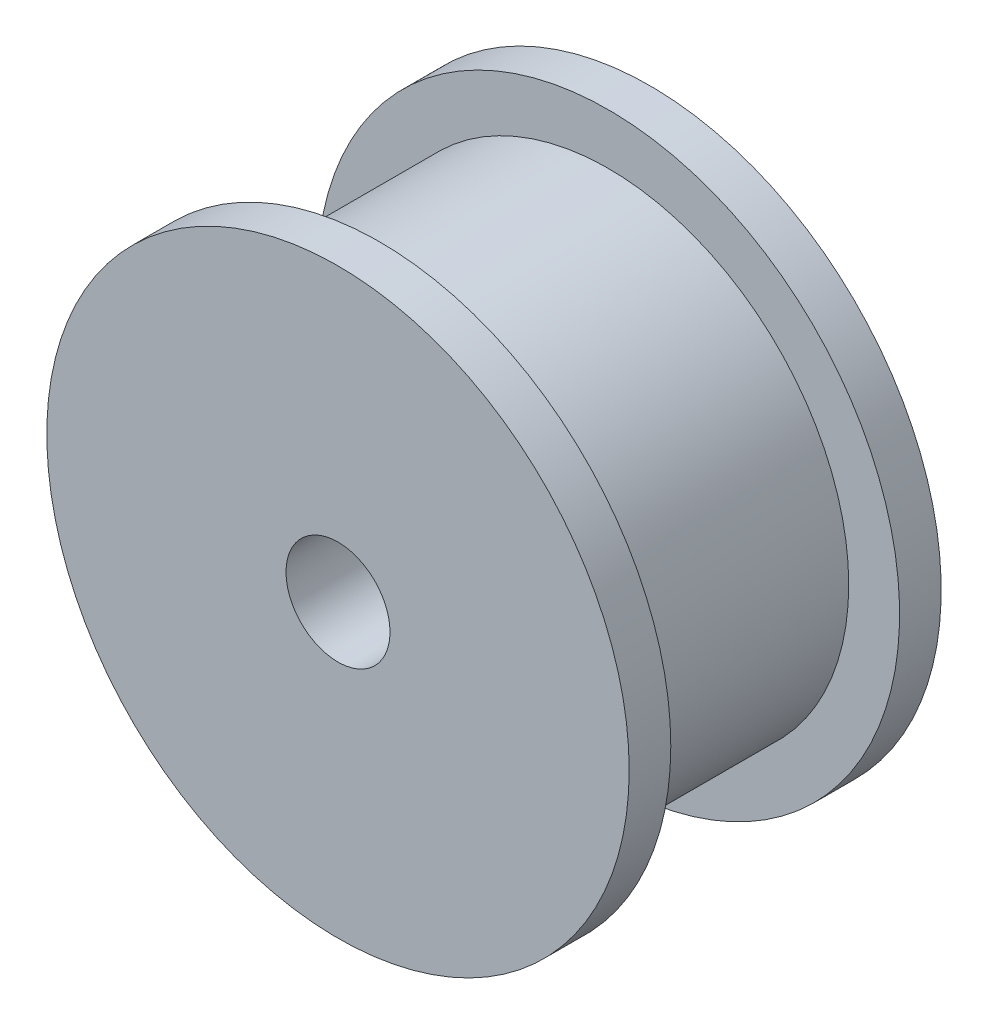
ISO-10303-21;
HEADER;
FILE_DESCRIPTION(('STEP AP214'),'2;1');
FILE_NAME('part.step','',(''),(''),'','','');
FILE_SCHEMA(('AUTOMOTIVE_DESIGN { 1 0 10303 214 1 1 1 1 }'));
ENDSEC;
DATA;
#1=APPLICATION_CONTEXT('core data for automotive mechanical design processes');
#2=APPLICATION_PROTOCOL_DEFINITION('international standard','automotive_design',2000,#1);
#3=PRODUCT_CONTEXT('',#1,'mechanical');
#4=PRODUCT('Part','Part','',(#3));
#5=PRODUCT_RELATED_PRODUCT_CATEGORY('part','',(#4));
#6=PRODUCT_DEFINITION_FORMATION('','',#4);
#7=PRODUCT_DEFINITION_CONTEXT('part definition',#1,'design');
#8=PRODUCT_DEFINITION('design','',#6,#7);
#9=PRODUCT_DEFINITION_SHAPE('','',#8);
#10=(LENGTH_UNIT() NAMED_UNIT(*) SI_UNIT(.MILLI.,.METRE.));
#11=(NAMED_UNIT(*) PLANE_ANGLE_UNIT() SI_UNIT($,.RADIAN.));
#12=(NAMED_UNIT(*) SI_UNIT($,.STERADIAN.) SOLID_ANGLE_UNIT());
#13=UNCERTAINTY_MEASURE_WITH_UNIT(LENGTH_MEASURE(1.E-05),#10,'distance_accuracy_value','');
#14=(GEOMETRIC_REPRESENTATION_CONTEXT(3) GLOBAL_UNCERTAINTY_ASSIGNED_CONTEXT((#13)) GLOBAL_UNIT_ASSIGNED_CONTEXT((#10,
#11,#12)) REPRESENTATION_CONTEXT('',''));
#15=CARTESIAN_POINT('',(0.,0.,0.));
#16=DIRECTION('',(0.,0.,1.));
#17=DIRECTION('',(1.,0.,0.));
#18=AXIS2_PLACEMENT_3D('',#15,#16,#17);
#19=CARTESIAN_POINT('',(0.,0.,11.));
#20=DIRECTION('',(0.,0.,-1.));
#21=DIRECTION('',(-1.,0.,0.));
#22=AXIS2_PLACEMENT_3D('',#19,#20,#21);
#23=CYLINDRICAL_SURFACE('',#22,11.555);
#24=CARTESIAN_POINT('',(0.,0.,11.));
#25=DIRECTION('',(0.,0.,1.));
#26=DIRECTION('',(1.,0.,0.));
#27=AXIS2_PLACEMENT_3D('',#24,#25,#26);
#28=CIRCLE('',#27,11.555);
#29=CARTESIAN_POINT('',(11.555,0.,11.));
#30=VERTEX_POINT('',#29);
#31=EDGE_CURVE('E10',#30,#30,#28,.T.);
#32=ORIENTED_EDGE('',*,*,#31,.F.);
#33=EDGE_LOOP('',(#32));
#34=FACE_BOUND('',#33,.T.);
#35=CARTESIAN_POINT('',(0.,0.,0.));
#36=DIRECTION('',(0.,0.,1.));
#37=DIRECTION('',(1.,0.,0.));
#38=AXIS2_PLACEMENT_3D('',#35,#36,#37);
#39=CIRCLE('',#38,11.555);
#40=CARTESIAN_POINT('',(11.555,0.,0.));
#41=VERTEX_POINT('',#40);
#42=EDGE_CURVE('E39',#41,#41,#39,.T.);
#43=ORIENTED_EDGE('',*,*,#42,.T.);
#44=EDGE_LOOP('',(#43));
#45=FACE_BOUND('',#44,.T.);
#46=ADVANCED_FACE('F36',(#34,#45),#23,.T.);
#47=CARTESIAN_POINT('',(0.,0.,13.));
#48=DIRECTION('',(0.,0.,-1.));
#49=DIRECTION('',(-1.,0.,0.));
#50=AXIS2_PLACEMENT_3D('',#47,#48,#49);
#51=CYLINDRICAL_SURFACE('',#50,14.);
#52=CARTESIAN_POINT('',(0.,0.,13.));
#53=DIRECTION('',(0.,0.,1.));
#54=DIRECTION('',(1.,0.,0.));
#55=AXIS2_PLACEMENT_3D('',#52,#53,#54);
#56=CIRCLE('',#55,14.);
#57=CARTESIAN_POINT('',(14.,0.,13.));
#58=VERTEX_POINT('',#57);
#59=EDGE_CURVE('E44',#58,#58,#56,.T.);
#60=ORIENTED_EDGE('',*,*,#59,.F.);
#61=EDGE_LOOP('',(#60));
#62=FACE_BOUND('',#61,.T.);
#63=CARTESIAN_POINT('',(0.,0.,11.));
#64=DIRECTION('',(0.,0.,1.));
#65=DIRECTION('',(1.,0.,0.));
#66=AXIS2_PLACEMENT_3D('',#63,#64,#65);
#67=CIRCLE('',#66,14.);
#68=CARTESIAN_POINT('',(14.,0.,11.));
#69=VERTEX_POINT('',#68);
#70=EDGE_CURVE('E50',#69,#69,#67,.T.);
#71=ORIENTED_EDGE('',*,*,#70,.T.);
#72=EDGE_LOOP('',(#71));
#73=FACE_BOUND('',#72,.T.);
#74=ADVANCED_FACE('F102',(#62,#73),#51,.T.);
#75=CARTESIAN_POINT('',(0.,0.,13.));
#76=DIRECTION('',(0.,0.,1.));
#77=DIRECTION('',(1.,0.,0.));
#78=AXIS2_PLACEMENT_3D('',#75,#76,#77);
#79=PLANE('',#78);
#80=CARTESIAN_POINT('',(0.,0.,13.));
#81=DIRECTION('',(0.,0.,-1.));
#82=DIRECTION('',(-1.,0.,0.));
#83=AXIS2_PLACEMENT_3D('',#80,#81,#82);
#84=CIRCLE('',#83,2.5);
#85=CARTESIAN_POINT('',(-2.5,0.,13.));
#86=VERTEX_POINT('',#85);
#87=EDGE_CURVE('E61',#86,#86,#84,.T.);
#88=ORIENTED_EDGE('',*,*,#87,.T.);
#89=EDGE_LOOP('',(#88));
#90=FACE_BOUND('',#89,.T.);
#91=ORIENTED_EDGE('',*,*,#59,.T.);
#92=EDGE_LOOP('',(#91));
#93=FACE_BOUND('',#92,.T.);
#94=ADVANCED_FACE('F72',(#90,#93),#79,.T.);
#95=CARTESIAN_POINT('',(0.,0.,11.));
#96=DIRECTION('',(0.,0.,1.));
#97=DIRECTION('',(1.,0.,0.));
#98=AXIS2_PLACEMENT_3D('',#95,#96,#97);
#99=PLANE('',#98);
#100=ORIENTED_EDGE('',*,*,#31,.T.);
#101=EDGE_LOOP('',(#100));
#102=FACE_BOUND('',#101,.T.);
#103=ORIENTED_EDGE('',*,*,#70,.F.);
#104=EDGE_LOOP('',(#103));
#105=FACE_BOUND('',#104,.T.);
#106=ADVANCED_FACE('F91',(#102,#105),#99,.F.);
#107=CARTESIAN_POINT('',(0.,0.,-2.));
#108=DIRECTION('',(0.,0.,1.));
#109=DIRECTION('',(1.,0.,0.));
#110=AXIS2_PLACEMENT_3D('',#107,#108,#109);
#111=CYLINDRICAL_SURFACE('',#110,14.);
#112=CARTESIAN_POINT('',(0.,0.,-2.));
#113=DIRECTION('',(0.,0.,-1.));
#114=DIRECTION('',(-1.,0.,0.));
#115=AXIS2_PLACEMENT_3D('',#112,#113,#114);
#116=CIRCLE('',#115,14.);
#117=CARTESIAN_POINT('',(-14.,0.,-2.));
#118=VERTEX_POINT('',#117);
#119=EDGE_CURVE('E60',#118,#118,#116,.T.);
#120=ORIENTED_EDGE('',*,*,#119,.F.);
#121=EDGE_LOOP('',(#120));
#122=FACE_BOUND('',#121,.T.);
#123=CARTESIAN_POINT('',(0.,0.,0.));
#124=DIRECTION('',(0.,0.,-1.));
#125=DIRECTION('',(-1.,0.,0.));
#126=AXIS2_PLACEMENT_3D('',#123,#124,#125);
#127=CIRCLE('',#126,14.);
#128=CARTESIAN_POINT('',(-14.,0.,0.));
#129=VERTEX_POINT('',#128);
#130=EDGE_CURVE('E56',#129,#129,#127,.T.);
#131=ORIENTED_EDGE('',*,*,#130,.T.);
#132=EDGE_LOOP('',(#131));
#133=FACE_BOUND('',#132,.T.);
#134=ADVANCED_FACE('F85',(#122,#133),#111,.T.);
#135=CARTESIAN_POINT('',(0.,0.,-2.));
#136=DIRECTION('',(0.,0.,-1.));
#137=DIRECTION('',(-1.,0.,0.));
#138=AXIS2_PLACEMENT_3D('',#135,#136,#137);
#139=PLANE('',#138);
#140=CARTESIAN_POINT('',(0.,0.,-2.));
#141=DIRECTION('',(0.,0.,-1.));
#142=DIRECTION('',(-1.,0.,0.));
#143=AXIS2_PLACEMENT_3D('',#140,#141,#142);
#144=CIRCLE('',#143,2.5);
#145=CARTESIAN_POINT('',(-2.5,0.,-2.));
#146=VERTEX_POINT('',#145);
#147=EDGE_CURVE('E65',#146,#146,#144,.T.);
#148=ORIENTED_EDGE('',*,*,#147,.F.);
#149=EDGE_LOOP('',(#148));
#150=FACE_BOUND('',#149,.T.);
#151=ORIENTED_EDGE('',*,*,#119,.T.);
#152=EDGE_LOOP('',(#151));
#153=FACE_BOUND('',#152,.T.);
#154=ADVANCED_FACE('F82',(#150,#153),#139,.T.);
#155=CARTESIAN_POINT('',(0.,0.,0.));
#156=DIRECTION('',(0.,0.,-1.));
#157=DIRECTION('',(-1.,0.,0.));
#158=AXIS2_PLACEMENT_3D('',#155,#156,#157);
#159=PLANE('',#158);
#160=ORIENTED_EDGE('',*,*,#42,.F.);
#161=EDGE_LOOP('',(#160));
#162=FACE_BOUND('',#161,.T.);
#163=ORIENTED_EDGE('',*,*,#130,.F.);
#164=EDGE_LOOP('',(#163));
#165=FACE_BOUND('',#164,.T.);
#166=ADVANCED_FACE('F78',(#162,#165),#159,.F.);
#167=CARTESIAN_POINT('',(0.,0.,13.));
#168=DIRECTION('',(0.,0.,-1.));
#169=DIRECTION('',(-1.,0.,0.));
#170=AXIS2_PLACEMENT_3D('',#167,#168,#169);
#171=CYLINDRICAL_SURFACE('',#170,2.5);
#172=ORIENTED_EDGE('',*,*,#87,.F.);
#173=EDGE_LOOP('',(#172));
#174=FACE_BOUND('',#173,.T.);
#175=ORIENTED_EDGE('',*,*,#147,.T.);
#176=EDGE_LOOP('',(#175));
#177=FACE_BOUND('',#176,.T.);
#178=ADVANCED_FACE('F75',(#174,#177),#171,.F.);
#179=CLOSED_SHELL('',(#46,#74,#94,#106,#134,#154,#166,#178));
#180=MANIFOLD_SOLID_BREP('B2',#179);
#181=ADVANCED_BREP_SHAPE_REPRESENTATION('',(#18,#180),#14);
#182=SHAPE_DEFINITION_REPRESENTATION(#9,#181);
ENDSEC;
END-ISO-10303-21;
